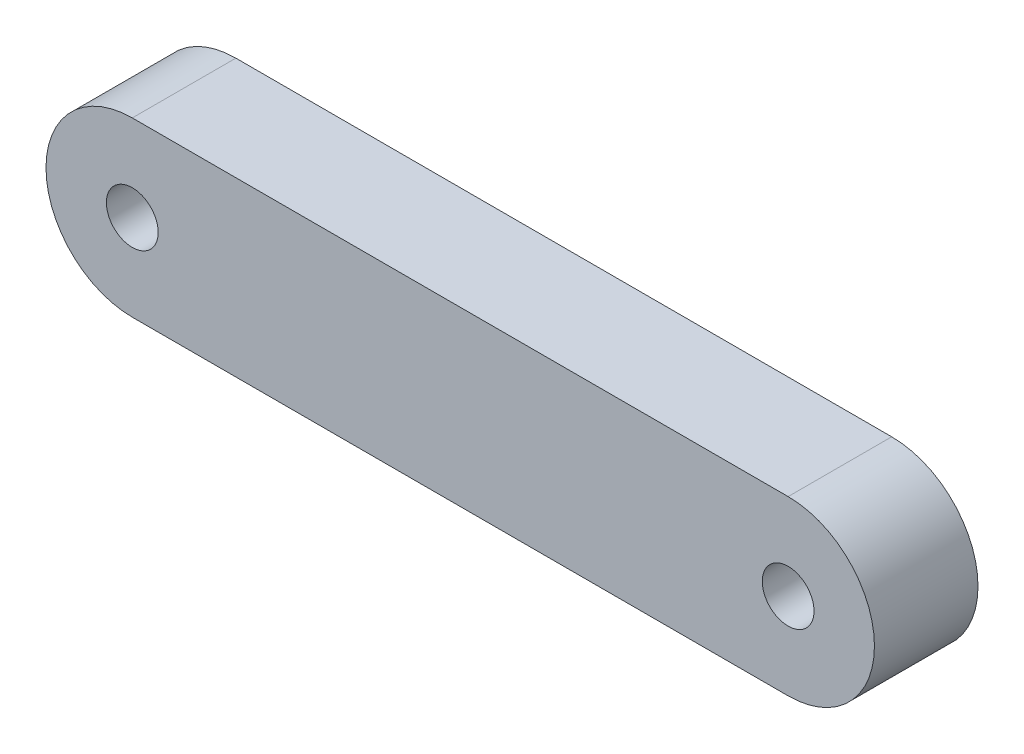
ISO-10303-21;
HEADER;
FILE_DESCRIPTION(('STEP AP214'),'2;1');
FILE_NAME('part.step','',(''),(''),'','','');
FILE_SCHEMA(('AUTOMOTIVE_DESIGN { 1 0 10303 214 1 1 1 1 }'));
ENDSEC;
DATA;
#1=APPLICATION_CONTEXT('core data for automotive mechanical design processes');
#2=APPLICATION_PROTOCOL_DEFINITION('international standard','automotive_design',2000,#1);
#3=PRODUCT_CONTEXT('',#1,'mechanical');
#4=PRODUCT('Part','Part','',(#3));
#5=PRODUCT_RELATED_PRODUCT_CATEGORY('part','',(#4));
#6=PRODUCT_DEFINITION_FORMATION('','',#4);
#7=PRODUCT_DEFINITION_CONTEXT('part definition',#1,'design');
#8=PRODUCT_DEFINITION('design','',#6,#7);
#9=PRODUCT_DEFINITION_SHAPE('','',#8);
#10=(LENGTH_UNIT() NAMED_UNIT(*) SI_UNIT(.MILLI.,.METRE.));
#11=(NAMED_UNIT(*) PLANE_ANGLE_UNIT() SI_UNIT($,.RADIAN.));
#12=(NAMED_UNIT(*) SI_UNIT($,.STERADIAN.) SOLID_ANGLE_UNIT());
#13=UNCERTAINTY_MEASURE_WITH_UNIT(LENGTH_MEASURE(1.E-05),#10,'distance_accuracy_value','');
#14=(GEOMETRIC_REPRESENTATION_CONTEXT(3) GLOBAL_UNCERTAINTY_ASSIGNED_CONTEXT((#13)) GLOBAL_UNIT_ASSIGNED_CONTEXT((#10,
#11,#12)) REPRESENTATION_CONTEXT('',''));
#15=CARTESIAN_POINT('',(0.,0.,0.));
#16=DIRECTION('',(0.,0.,1.));
#17=DIRECTION('',(1.,0.,0.));
#18=AXIS2_PLACEMENT_3D('',#15,#16,#17);
#19=CARTESIAN_POINT('',(0.,5.,6.));
#20=DIRECTION('',(0.,-1.,0.));
#21=DIRECTION('',(0.,0.,-1.));
#22=AXIS2_PLACEMENT_3D('',#19,#20,#21);
#23=PLANE('',#22);
#24=DIRECTION('',(-1.,0.,0.));
#25=VECTOR('',#24,1.);
#26=CARTESIAN_POINT('',(0.,5.,0.));
#27=LINE('',#26,#25);
#28=CARTESIAN_POINT('',(38.,5.,0.));
#29=VERTEX_POINT('',#28);
#30=CARTESIAN_POINT('',(0.,5.,0.));
#31=VERTEX_POINT('',#30);
#32=EDGE_CURVE('E106',#29,#31,#27,.T.);
#33=ORIENTED_EDGE('',*,*,#32,.T.);
#34=DIRECTION('',(0.,0.,-1.));
#35=VECTOR('',#34,1.);
#36=CARTESIAN_POINT('',(0.,5.,6.));
#37=LINE('',#36,#35);
#38=CARTESIAN_POINT('',(0.,5.,6.));
#39=VERTEX_POINT('',#38);
#40=EDGE_CURVE('E11',#39,#31,#37,.T.);
#41=ORIENTED_EDGE('',*,*,#40,.F.);
#42=DIRECTION('',(-1.,0.,0.));
#43=VECTOR('',#42,1.);
#44=CARTESIAN_POINT('',(0.,5.,6.));
#45=LINE('',#44,#43);
#46=CARTESIAN_POINT('',(38.,5.,6.));
#47=VERTEX_POINT('',#46);
#48=EDGE_CURVE('E88',#47,#39,#45,.T.);
#49=ORIENTED_EDGE('',*,*,#48,.F.);
#50=DIRECTION('',(0.,0.,-1.));
#51=VECTOR('',#50,1.);
#52=CARTESIAN_POINT('',(38.,5.,6.));
#53=LINE('',#52,#51);
#54=EDGE_CURVE('E96',#47,#29,#53,.T.);
#55=ORIENTED_EDGE('',*,*,#54,.T.);
#56=EDGE_LOOP('',(#33,#41,#49,#55));
#57=FACE_BOUND('',#56,.T.);
#58=ADVANCED_FACE('F36',(#57),#23,.F.);
#59=CARTESIAN_POINT('',(0.,0.,6.));
#60=DIRECTION('',(0.,0.,-1.));
#61=DIRECTION('',(-1.,0.,0.));
#62=AXIS2_PLACEMENT_3D('',#59,#60,#61);
#63=CYLINDRICAL_SURFACE('',#62,5.);
#64=CARTESIAN_POINT('',(0.,0.,0.));
#65=DIRECTION('',(0.,0.,1.));
#66=DIRECTION('',(1.,0.,0.));
#67=AXIS2_PLACEMENT_3D('',#64,#65,#66);
#68=CIRCLE('',#67,5.);
#69=CARTESIAN_POINT('',(0.,-5.,0.));
#70=VERTEX_POINT('',#69);
#71=EDGE_CURVE('E92',#31,#70,#68,.T.);
#72=ORIENTED_EDGE('',*,*,#71,.T.);
#73=DIRECTION('',(0.,0.,-1.));
#74=VECTOR('',#73,1.);
#75=CARTESIAN_POINT('',(0.,-5.,6.));
#76=LINE('',#75,#74);
#77=CARTESIAN_POINT('',(0.,-5.,6.));
#78=VERTEX_POINT('',#77);
#79=EDGE_CURVE('E45',#78,#70,#76,.T.);
#80=ORIENTED_EDGE('',*,*,#79,.F.);
#81=CARTESIAN_POINT('',(0.,0.,6.));
#82=DIRECTION('',(0.,0.,1.));
#83=DIRECTION('',(1.,0.,0.));
#84=AXIS2_PLACEMENT_3D('',#81,#82,#83);
#85=CIRCLE('',#84,5.);
#86=EDGE_CURVE('E83',#39,#78,#85,.T.);
#87=ORIENTED_EDGE('',*,*,#86,.F.);
#88=ORIENTED_EDGE('',*,*,#40,.T.);
#89=EDGE_LOOP('',(#72,#80,#87,#88));
#90=FACE_BOUND('',#89,.T.);
#91=ADVANCED_FACE('F91',(#90),#63,.T.);
#92=CARTESIAN_POINT('',(0.,-5.,6.));
#93=DIRECTION('',(0.,1.,0.));
#94=DIRECTION('',(-1.,0.,0.));
#95=AXIS2_PLACEMENT_3D('',#92,#93,#94);
#96=PLANE('',#95);
#97=DIRECTION('',(1.,0.,0.));
#98=VECTOR('',#97,1.);
#99=CARTESIAN_POINT('',(0.,-5.,0.));
#100=LINE('',#99,#98);
#101=CARTESIAN_POINT('',(38.,-5.,0.));
#102=VERTEX_POINT('',#101);
#103=EDGE_CURVE('E70',#70,#102,#100,.T.);
#104=ORIENTED_EDGE('',*,*,#103,.T.);
#105=DIRECTION('',(0.,0.,-1.));
#106=VECTOR('',#105,1.);
#107=CARTESIAN_POINT('',(38.,-5.,6.));
#108=LINE('',#107,#106);
#109=CARTESIAN_POINT('',(38.,-5.,6.));
#110=VERTEX_POINT('',#109);
#111=EDGE_CURVE('E93',#110,#102,#108,.T.);
#112=ORIENTED_EDGE('',*,*,#111,.F.);
#113=DIRECTION('',(1.,0.,0.));
#114=VECTOR('',#113,1.);
#115=CARTESIAN_POINT('',(0.,-5.,6.));
#116=LINE('',#115,#114);
#117=EDGE_CURVE('E86',#78,#110,#116,.T.);
#118=ORIENTED_EDGE('',*,*,#117,.F.);
#119=ORIENTED_EDGE('',*,*,#79,.T.);
#120=EDGE_LOOP('',(#104,#112,#118,#119));
#121=FACE_BOUND('',#120,.T.);
#122=ADVANCED_FACE('F94',(#121),#96,.F.);
#123=CARTESIAN_POINT('',(0.,0.,6.));
#124=DIRECTION('',(0.,0.,-1.));
#125=DIRECTION('',(-1.,0.,0.));
#126=AXIS2_PLACEMENT_3D('',#123,#124,#125);
#127=CYLINDRICAL_SURFACE('',#126,1.5);
#128=CARTESIAN_POINT('',(0.,0.,6.));
#129=DIRECTION('',(0.,0.,1.));
#130=DIRECTION('',(1.,0.,0.));
#131=AXIS2_PLACEMENT_3D('',#128,#129,#130);
#132=CIRCLE('',#131,1.5);
#133=CARTESIAN_POINT('',(-1.5,0.,6.));
#134=VERTEX_POINT('',#133);
#135=EDGE_CURVE('E119',#134,#134,#132,.T.);
#136=CARTESIAN_POINT('',(0.,0.,0.));
#137=DIRECTION('',(0.,0.,1.));
#138=DIRECTION('',(1.,0.,0.));
#139=AXIS2_PLACEMENT_3D('',#136,#137,#138);
#140=CIRCLE('',#139,1.5);
#141=CARTESIAN_POINT('',(-1.5,0.,0.));
#142=VERTEX_POINT('',#141);
#143=EDGE_CURVE('E103',#142,#142,#140,.T.);
#144=CARTESIAN_POINT('',(-1.5,0.,6.));
#145=CARTESIAN_POINT('',(-1.5,0.,5.9375));
#146=CARTESIAN_POINT('',(-1.5,0.,5.875));
#147=CARTESIAN_POINT('',(-1.5,0.,5.75));
#148=CARTESIAN_POINT('',(-1.5,0.,5.6875));
#149=CARTESIAN_POINT('',(-1.5,0.,5.5625));
#150=CARTESIAN_POINT('',(-1.5,0.,5.5));
#151=CARTESIAN_POINT('',(-1.5,0.,5.375));
#152=CARTESIAN_POINT('',(-1.5,0.,5.3125));
#153=CARTESIAN_POINT('',(-1.5,0.,5.1875));
#154=CARTESIAN_POINT('',(-1.5,0.,5.125));
#155=CARTESIAN_POINT('',(-1.5,0.,5.));
#156=CARTESIAN_POINT('',(-1.5,0.,4.9375));
#157=CARTESIAN_POINT('',(-1.5,0.,4.8125));
#158=CARTESIAN_POINT('',(-1.5,0.,4.75));
#159=CARTESIAN_POINT('',(-1.5,0.,4.625));
#160=CARTESIAN_POINT('',(-1.5,0.,4.5625));
#161=CARTESIAN_POINT('',(-1.5,0.,4.4375));
#162=CARTESIAN_POINT('',(-1.5,0.,4.375));
#163=CARTESIAN_POINT('',(-1.5,0.,4.25));
#164=CARTESIAN_POINT('',(-1.5,0.,4.1875));
#165=CARTESIAN_POINT('',(-1.5,0.,4.0625));
#166=CARTESIAN_POINT('',(-1.5,0.,4.));
#167=CARTESIAN_POINT('',(-1.5,0.,3.875));
#168=CARTESIAN_POINT('',(-1.5,0.,3.8125));
#169=CARTESIAN_POINT('',(-1.5,0.,3.6875));
#170=CARTESIAN_POINT('',(-1.5,0.,3.625));
#171=CARTESIAN_POINT('',(-1.5,0.,3.5));
#172=CARTESIAN_POINT('',(-1.5,0.,3.4375));
#173=CARTESIAN_POINT('',(-1.5,0.,3.3125));
#174=CARTESIAN_POINT('',(-1.5,0.,3.25));
#175=CARTESIAN_POINT('',(-1.5,0.,3.125));
#176=CARTESIAN_POINT('',(-1.5,0.,3.0625));
#177=CARTESIAN_POINT('',(-1.5,0.,2.9375));
#178=CARTESIAN_POINT('',(-1.5,0.,2.875));
#179=CARTESIAN_POINT('',(-1.5,0.,2.75));
#180=CARTESIAN_POINT('',(-1.5,0.,2.6875));
#181=CARTESIAN_POINT('',(-1.5,0.,2.5625));
#182=CARTESIAN_POINT('',(-1.5,0.,2.5));
#183=CARTESIAN_POINT('',(-1.5,0.,2.375));
#184=CARTESIAN_POINT('',(-1.5,0.,2.3125));
#185=CARTESIAN_POINT('',(-1.5,0.,2.1875));
#186=CARTESIAN_POINT('',(-1.5,0.,2.125));
#187=CARTESIAN_POINT('',(-1.5,0.,2.));
#188=CARTESIAN_POINT('',(-1.5,0.,1.9375));
#189=CARTESIAN_POINT('',(-1.5,0.,1.8125));
#190=CARTESIAN_POINT('',(-1.5,0.,1.75));
#191=CARTESIAN_POINT('',(-1.5,0.,1.625));
#192=CARTESIAN_POINT('',(-1.5,0.,1.5625));
#193=CARTESIAN_POINT('',(-1.5,0.,1.4375));
#194=CARTESIAN_POINT('',(-1.5,0.,1.375));
#195=CARTESIAN_POINT('',(-1.5,0.,1.25));
#196=CARTESIAN_POINT('',(-1.5,0.,1.1875));
#197=CARTESIAN_POINT('',(-1.5,0.,1.0625));
#198=CARTESIAN_POINT('',(-1.5,0.,1.));
#199=CARTESIAN_POINT('',(-1.5,0.,0.875));
#200=CARTESIAN_POINT('',(-1.5,0.,0.8125));
#201=CARTESIAN_POINT('',(-1.5,0.,0.687500000000001));
#202=CARTESIAN_POINT('',(-1.5,0.,0.625000000000001));
#203=CARTESIAN_POINT('',(-1.5,0.,0.5));
#204=CARTESIAN_POINT('',(-1.5,0.,0.4375));
#205=CARTESIAN_POINT('',(-1.5,0.,0.3125));
#206=CARTESIAN_POINT('',(-1.5,0.,0.25));
#207=CARTESIAN_POINT('',(-1.5,0.,0.125));
#208=CARTESIAN_POINT('',(-1.5,0.,0.0625000000000001));
#209=CARTESIAN_POINT('',(-1.5,0.,0.));
#210=B_SPLINE_CURVE_WITH_KNOTS('',3,(#144,#145,#146,#147,#148,#149,#150,#151,#152,#153,#154,
#155,#156,#157,#158,#159,#160,#161,#162,#163,#164,#165,#166,#167,#168,#169,#170,#171,#172,#173,
#174,#175,#176,#177,#178,#179,#180,#181,#182,#183,#184,#185,#186,#187,#188,#189,#190,#191,#192,
#193,#194,#195,#196,#197,#198,#199,#200,#201,#202,#203,#204,#205,#206,#207,#208,#209),
.UNSPECIFIED.,.F.,.F.,(4,2,2,2,2,2,2,2,2,2,2,2,2,2,2,2,2,2,2,2,2,2,2,2,2,2,2,2,2,2,2,2,4),(0.,
0.1875,0.375,0.5625,0.750000000000001,0.937500000000001,1.125,1.3125,1.5,1.6875,1.875,2.0625,
2.25,2.4375,2.625,2.8125,3.,3.1875,3.375,3.5625,3.75,3.9375,4.125,4.3125,4.5,4.6875,4.875,
5.0625,5.25,5.4375,5.625,5.8125,6.),.UNSPECIFIED.);
#211=EDGE_CURVE('BSEAM133',#134,#142,#210,.T.);
#212=ORIENTED_EDGE('',*,*,#135,.T.);
#213=ORIENTED_EDGE('',*,*,#143,.F.);
#214=ORIENTED_EDGE('',*,*,#211,.T.);
#215=ORIENTED_EDGE('',*,*,#211,.F.);
#216=EDGE_LOOP('',(#212,#214,#213,#215));
#217=FACE_BOUND('',#216,.T.);
#218=ADVANCED_FACE('F133',(#217),#127,.F.);
#219=CARTESIAN_POINT('',(38.,0.,6.));
#220=DIRECTION('',(0.,0.,-1.));
#221=DIRECTION('',(-1.,0.,0.));
#222=AXIS2_PLACEMENT_3D('',#219,#220,#221);
#223=CYLINDRICAL_SURFACE('',#222,1.5);
#224=CARTESIAN_POINT('',(38.,0.,6.));
#225=DIRECTION('',(0.,0.,1.));
#226=DIRECTION('',(1.,0.,0.));
#227=AXIS2_PLACEMENT_3D('',#224,#225,#226);
#228=CIRCLE('',#227,1.5);
#229=CARTESIAN_POINT('',(36.5,0.,6.));
#230=VERTEX_POINT('',#229);
#231=EDGE_CURVE('E112',#230,#230,#228,.T.);
#232=CARTESIAN_POINT('',(38.,0.,0.));
#233=DIRECTION('',(0.,0.,1.));
#234=DIRECTION('',(1.,0.,0.));
#235=AXIS2_PLACEMENT_3D('',#232,#233,#234);
#236=CIRCLE('',#235,1.5);
#237=CARTESIAN_POINT('',(36.5,0.,0.));
#238=VERTEX_POINT('',#237);
#239=EDGE_CURVE('E100',#238,#238,#236,.T.);
#240=CARTESIAN_POINT('',(36.5,0.,6.));
#241=CARTESIAN_POINT('',(36.5,0.,5.9375));
#242=CARTESIAN_POINT('',(36.5,0.,5.875));
#243=CARTESIAN_POINT('',(36.5,0.,5.75));
#244=CARTESIAN_POINT('',(36.5,0.,5.6875));
#245=CARTESIAN_POINT('',(36.5,0.,5.5625));
#246=CARTESIAN_POINT('',(36.5,0.,5.5));
#247=CARTESIAN_POINT('',(36.5,0.,5.375));
#248=CARTESIAN_POINT('',(36.5,0.,5.3125));
#249=CARTESIAN_POINT('',(36.5,0.,5.1875));
#250=CARTESIAN_POINT('',(36.5,0.,5.125));
#251=CARTESIAN_POINT('',(36.5,0.,5.));
#252=CARTESIAN_POINT('',(36.5,0.,4.9375));
#253=CARTESIAN_POINT('',(36.5,0.,4.8125));
#254=CARTESIAN_POINT('',(36.5,0.,4.75));
#255=CARTESIAN_POINT('',(36.5,0.,4.625));
#256=CARTESIAN_POINT('',(36.5,0.,4.5625));
#257=CARTESIAN_POINT('',(36.5,0.,4.4375));
#258=CARTESIAN_POINT('',(36.5,0.,4.375));
#259=CARTESIAN_POINT('',(36.5,0.,4.25));
#260=CARTESIAN_POINT('',(36.5,0.,4.1875));
#261=CARTESIAN_POINT('',(36.5,0.,4.0625));
#262=CARTESIAN_POINT('',(36.5,0.,4.));
#263=CARTESIAN_POINT('',(36.5,0.,3.875));
#264=CARTESIAN_POINT('',(36.5,0.,3.8125));
#265=CARTESIAN_POINT('',(36.5,0.,3.6875));
#266=CARTESIAN_POINT('',(36.5,0.,3.625));
#267=CARTESIAN_POINT('',(36.5,0.,3.5));
#268=CARTESIAN_POINT('',(36.5,0.,3.4375));
#269=CARTESIAN_POINT('',(36.5,0.,3.3125));
#270=CARTESIAN_POINT('',(36.5,0.,3.25));
#271=CARTESIAN_POINT('',(36.5,0.,3.125));
#272=CARTESIAN_POINT('',(36.5,0.,3.0625));
#273=CARTESIAN_POINT('',(36.5,0.,2.9375));
#274=CARTESIAN_POINT('',(36.5,0.,2.875));
#275=CARTESIAN_POINT('',(36.5,0.,2.75));
#276=CARTESIAN_POINT('',(36.5,0.,2.6875));
#277=CARTESIAN_POINT('',(36.5,0.,2.5625));
#278=CARTESIAN_POINT('',(36.5,0.,2.5));
#279=CARTESIAN_POINT('',(36.5,0.,2.375));
#280=CARTESIAN_POINT('',(36.5,0.,2.3125));
#281=CARTESIAN_POINT('',(36.5,0.,2.1875));
#282=CARTESIAN_POINT('',(36.5,0.,2.125));
#283=CARTESIAN_POINT('',(36.5,0.,2.));
#284=CARTESIAN_POINT('',(36.5,0.,1.9375));
#285=CARTESIAN_POINT('',(36.5,0.,1.8125));
#286=CARTESIAN_POINT('',(36.5,0.,1.75));
#287=CARTESIAN_POINT('',(36.5,0.,1.625));
#288=CARTESIAN_POINT('',(36.5,0.,1.5625));
#289=CARTESIAN_POINT('',(36.5,0.,1.4375));
#290=CARTESIAN_POINT('',(36.5,0.,1.375));
#291=CARTESIAN_POINT('',(36.5,0.,1.25));
#292=CARTESIAN_POINT('',(36.5,0.,1.1875));
#293=CARTESIAN_POINT('',(36.5,0.,1.0625));
#294=CARTESIAN_POINT('',(36.5,0.,1.));
#295=CARTESIAN_POINT('',(36.5,0.,0.875));
#296=CARTESIAN_POINT('',(36.5,0.,0.8125));
#297=CARTESIAN_POINT('',(36.5,0.,0.687500000000001));
#298=CARTESIAN_POINT('',(36.5,0.,0.625000000000001));
#299=CARTESIAN_POINT('',(36.5,0.,0.5));
#300=CARTESIAN_POINT('',(36.5,0.,0.4375));
#301=CARTESIAN_POINT('',(36.5,0.,0.3125));
#302=CARTESIAN_POINT('',(36.5,0.,0.25));
#303=CARTESIAN_POINT('',(36.5,0.,0.125));
#304=CARTESIAN_POINT('',(36.5,0.,0.0625000000000001));
#305=CARTESIAN_POINT('',(36.5,0.,0.));
#306=B_SPLINE_CURVE_WITH_KNOTS('',3,(#240,#241,#242,#243,#244,#245,#246,#247,#248,#249,#250,
#251,#252,#253,#254,#255,#256,#257,#258,#259,#260,#261,#262,#263,#264,#265,#266,#267,#268,#269,
#270,#271,#272,#273,#274,#275,#276,#277,#278,#279,#280,#281,#282,#283,#284,#285,#286,#287,#288,
#289,#290,#291,#292,#293,#294,#295,#296,#297,#298,#299,#300,#301,#302,#303,#304,#305),
.UNSPECIFIED.,.F.,.F.,(4,2,2,2,2,2,2,2,2,2,2,2,2,2,2,2,2,2,2,2,2,2,2,2,2,2,2,2,2,2,2,2,4),(0.,
0.1875,0.375,0.5625,0.750000000000001,0.937500000000001,1.125,1.3125,1.5,1.6875,1.875,2.0625,
2.25,2.4375,2.625,2.8125,3.,3.1875,3.375,3.5625,3.75,3.9375,4.125,4.3125,4.5,4.6875,4.875,
5.0625,5.25,5.4375,5.625,5.8125,6.),.UNSPECIFIED.);
#307=EDGE_CURVE('BSEAM38',#230,#238,#306,.T.);
#308=ORIENTED_EDGE('',*,*,#231,.T.);
#309=ORIENTED_EDGE('',*,*,#239,.F.);
#310=ORIENTED_EDGE('',*,*,#307,.T.);
#311=ORIENTED_EDGE('',*,*,#307,.F.);
#312=EDGE_LOOP('',(#308,#310,#309,#311));
#313=FACE_BOUND('',#312,.T.);
#314=ADVANCED_FACE('F38',(#313),#223,.F.);
#315=CARTESIAN_POINT('',(38.,0.,6.));
#316=DIRECTION('',(0.,0.,-1.));
#317=DIRECTION('',(-1.,0.,0.));
#318=AXIS2_PLACEMENT_3D('',#315,#316,#317);
#319=CYLINDRICAL_SURFACE('',#318,5.);
#320=CARTESIAN_POINT('',(38.,0.,0.));
#321=DIRECTION('',(0.,0.,1.));
#322=DIRECTION('',(1.,0.,0.));
#323=AXIS2_PLACEMENT_3D('',#320,#321,#322);
#324=CIRCLE('',#323,5.);
#325=EDGE_CURVE('E76',#102,#29,#324,.T.);
#326=ORIENTED_EDGE('',*,*,#325,.T.);
#327=ORIENTED_EDGE('',*,*,#54,.F.);
#328=CARTESIAN_POINT('',(38.,0.,6.));
#329=DIRECTION('',(0.,0.,1.));
#330=DIRECTION('',(1.,0.,0.));
#331=AXIS2_PLACEMENT_3D('',#328,#329,#330);
#332=CIRCLE('',#331,5.);
#333=EDGE_CURVE('E53',#110,#47,#332,.T.);
#334=ORIENTED_EDGE('',*,*,#333,.F.);
#335=ORIENTED_EDGE('',*,*,#111,.T.);
#336=EDGE_LOOP('',(#326,#327,#334,#335));
#337=FACE_BOUND('',#336,.T.);
#338=ADVANCED_FACE('F114',(#337),#319,.T.);
#339=CARTESIAN_POINT('',(0.,0.,6.));
#340=DIRECTION('',(0.,0.,1.));
#341=DIRECTION('',(1.,0.,0.));
#342=AXIS2_PLACEMENT_3D('',#339,#340,#341);
#343=PLANE('',#342);
#344=ORIENTED_EDGE('',*,*,#231,.F.);
#345=EDGE_LOOP('',(#344));
#346=FACE_BOUND('',#345,.T.);
#347=ORIENTED_EDGE('',*,*,#135,.F.);
#348=EDGE_LOOP('',(#347));
#349=FACE_BOUND('',#348,.T.);
#350=ORIENTED_EDGE('',*,*,#48,.T.);
#351=ORIENTED_EDGE('',*,*,#86,.T.);
#352=ORIENTED_EDGE('',*,*,#117,.T.);
#353=ORIENTED_EDGE('',*,*,#333,.T.);
#354=EDGE_LOOP('',(#350,#351,#352,#353));
#355=FACE_BOUND('',#354,.T.);
#356=ADVANCED_FACE('F84',(#346,#349,#355),#343,.T.);
#357=CARTESIAN_POINT('',(0.,0.,0.));
#358=DIRECTION('',(0.,0.,1.));
#359=DIRECTION('',(1.,0.,0.));
#360=AXIS2_PLACEMENT_3D('',#357,#358,#359);
#361=PLANE('',#360);
#362=ORIENTED_EDGE('',*,*,#239,.T.);
#363=EDGE_LOOP('',(#362));
#364=FACE_BOUND('',#363,.T.);
#365=ORIENTED_EDGE('',*,*,#143,.T.);
#366=EDGE_LOOP('',(#365));
#367=FACE_BOUND('',#366,.T.);
#368=ORIENTED_EDGE('',*,*,#32,.F.);
#369=ORIENTED_EDGE('',*,*,#325,.F.);
#370=ORIENTED_EDGE('',*,*,#103,.F.);
#371=ORIENTED_EDGE('',*,*,#71,.F.);
#372=EDGE_LOOP('',(#368,#369,#370,#371));
#373=FACE_BOUND('',#372,.T.);
#374=ADVANCED_FACE('F117',(#364,#367,#373),#361,.F.);
#375=CLOSED_SHELL('',(#58,#91,#122,#218,#314,#338,#356,#374));
#376=MANIFOLD_SOLID_BREP('B2',#375);
#377=ADVANCED_BREP_SHAPE_REPRESENTATION('',(#18,#376),#14);
#378=SHAPE_DEFINITION_REPRESENTATION(#9,#377);
ENDSEC;
END-ISO-10303-21;
